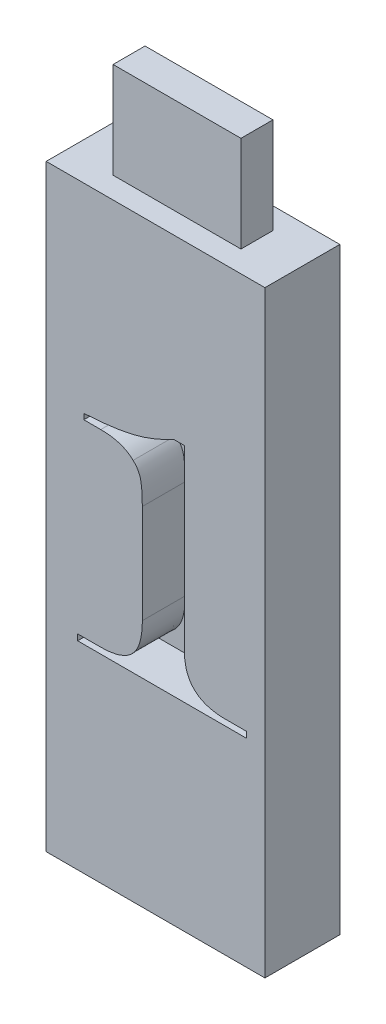
ISO-10303-21;
HEADER;
FILE_DESCRIPTION(('STEP AP214'),'2;1');
FILE_NAME('part.step','',(''),(''),'','','');
FILE_SCHEMA(('AUTOMOTIVE_DESIGN { 1 0 10303 214 1 1 1 1 }'));
ENDSEC;
DATA;
#1=APPLICATION_CONTEXT('core data for automotive mechanical design processes');
#2=APPLICATION_PROTOCOL_DEFINITION('international standard','automotive_design',2000,#1);
#3=PRODUCT_CONTEXT('',#1,'mechanical');
#4=PRODUCT('Part','Part','',(#3));
#5=PRODUCT_RELATED_PRODUCT_CATEGORY('part','',(#4));
#6=PRODUCT_DEFINITION_FORMATION('','',#4);
#7=PRODUCT_DEFINITION_CONTEXT('part definition',#1,'design');
#8=PRODUCT_DEFINITION('design','',#6,#7);
#9=PRODUCT_DEFINITION_SHAPE('','',#8);
#10=(LENGTH_UNIT() NAMED_UNIT(*) SI_UNIT(.MILLI.,.METRE.));
#11=(NAMED_UNIT(*) PLANE_ANGLE_UNIT() SI_UNIT($,.RADIAN.));
#12=(NAMED_UNIT(*) SI_UNIT($,.STERADIAN.) SOLID_ANGLE_UNIT());
#13=UNCERTAINTY_MEASURE_WITH_UNIT(LENGTH_MEASURE(1.E-05),#10,'distance_accuracy_value','');
#14=(GEOMETRIC_REPRESENTATION_CONTEXT(3) GLOBAL_UNCERTAINTY_ASSIGNED_CONTEXT((#13)) GLOBAL_UNIT_ASSIGNED_CONTEXT((#10,
#11,#12)) REPRESENTATION_CONTEXT('',''));
#15=CARTESIAN_POINT('',(0.,0.,0.));
#16=DIRECTION('',(0.,0.,1.));
#17=DIRECTION('',(1.,0.,0.));
#18=AXIS2_PLACEMENT_3D('',#15,#16,#17);
#19=CARTESIAN_POINT('',(-8.69,23.749,5.95));
#20=DIRECTION('',(0.,-1.,0.));
#21=DIRECTION('',(0.,0.,-1.));
#22=AXIS2_PLACEMENT_3D('',#19,#20,#21);
#23=PLANE('',#22);
#24=DIRECTION('',(-1.,0.,0.));
#25=VECTOR('',#24,1.);
#26=CARTESIAN_POINT('',(-8.69,23.749,0.));
#27=LINE('',#26,#25);
#28=CARTESIAN_POINT('',(8.69,23.749,0.));
#29=VERTEX_POINT('',#28);
#30=CARTESIAN_POINT('',(-8.69,23.749,0.));
#31=VERTEX_POINT('',#30);
#32=EDGE_CURVE('E284',#29,#31,#27,.T.);
#33=ORIENTED_EDGE('',*,*,#32,.T.);
#34=DIRECTION('',(0.,0.,-1.));
#35=VECTOR('',#34,1.);
#36=CARTESIAN_POINT('',(-8.69,23.749,5.95));
#37=LINE('',#36,#35);
#38=CARTESIAN_POINT('',(-8.69,23.749,5.95));
#39=VERTEX_POINT('',#38);
#40=EDGE_CURVE('E48',#39,#31,#37,.T.);
#41=ORIENTED_EDGE('',*,*,#40,.F.);
#42=DIRECTION('',(-1.,0.,0.));
#43=VECTOR('',#42,1.);
#44=CARTESIAN_POINT('',(-8.69,23.749,5.95));
#45=LINE('',#44,#43);
#46=CARTESIAN_POINT('',(8.69,23.749,5.95));
#47=VERTEX_POINT('',#46);
#48=EDGE_CURVE('E322',#47,#39,#45,.T.);
#49=ORIENTED_EDGE('',*,*,#48,.F.);
#50=DIRECTION('',(0.,0.,-1.));
#51=VECTOR('',#50,1.);
#52=CARTESIAN_POINT('',(8.69,23.749,5.95));
#53=LINE('',#52,#51);
#54=EDGE_CURVE('E11',#47,#29,#53,.T.);
#55=ORIENTED_EDGE('',*,*,#54,.T.);
#56=EDGE_LOOP('',(#33,#41,#49,#55));
#57=FACE_BOUND('',#56,.T.);
#58=DIRECTION('',(0.,0.,-1.));
#59=VECTOR('',#58,1.);
#60=CARTESIAN_POINT('',(5.08,23.749,4.245));
#61=LINE('',#60,#59);
#62=CARTESIAN_POINT('',(5.08,23.749,4.245));
#63=VERTEX_POINT('',#62);
#64=CARTESIAN_POINT('',(5.08,23.749,1.705));
#65=VERTEX_POINT('',#64);
#66=EDGE_CURVE('E55',#63,#65,#61,.T.);
#67=ORIENTED_EDGE('',*,*,#66,.F.);
#68=DIRECTION('',(1.,0.,0.));
#69=VECTOR('',#68,1.);
#70=CARTESIAN_POINT('',(-5.08,23.749,4.245));
#71=LINE('',#70,#69);
#72=CARTESIAN_POINT('',(-5.08,23.749,4.245));
#73=VERTEX_POINT('',#72);
#74=EDGE_CURVE('E59',#73,#63,#71,.T.);
#75=ORIENTED_EDGE('',*,*,#74,.F.);
#76=DIRECTION('',(0.,0.,1.));
#77=VECTOR('',#76,1.);
#78=CARTESIAN_POINT('',(-5.08,23.749,4.245));
#79=LINE('',#78,#77);
#80=CARTESIAN_POINT('',(-5.08,23.749,1.705));
#81=VERTEX_POINT('',#80);
#82=EDGE_CURVE('E784',#81,#73,#79,.T.);
#83=ORIENTED_EDGE('',*,*,#82,.F.);
#84=DIRECTION('',(-1.,0.,0.));
#85=VECTOR('',#84,1.);
#86=CARTESIAN_POINT('',(-5.08,23.749,1.705));
#87=LINE('',#86,#85);
#88=EDGE_CURVE('E794',#65,#81,#87,.T.);
#89=ORIENTED_EDGE('',*,*,#88,.F.);
#90=EDGE_LOOP('',(#67,#75,#83,#89));
#91=FACE_BOUND('',#90,.T.);
#92=ADVANCED_FACE('F39',(#57,#91),#23,.F.);
#93=CARTESIAN_POINT('',(0.,0.,5.95));
#94=DIRECTION('',(0.,0.,-1.));
#95=DIRECTION('',(-1.,0.,0.));
#96=AXIS2_PLACEMENT_3D('',#93,#94,#95);
#97=PLANE('',#96);
#98=DIRECTION('',(0.,1.,0.));
#99=VECTOR('',#98,1.);
#100=CARTESIAN_POINT('',(8.69,-23.749,5.95));
#101=LINE('',#100,#99);
#102=CARTESIAN_POINT('',(8.69,-23.749,5.95));
#103=VERTEX_POINT('',#102);
#104=EDGE_CURVE('E305',#103,#47,#101,.T.);
#105=ORIENTED_EDGE('',*,*,#104,.T.);
#106=ORIENTED_EDGE('',*,*,#48,.T.);
#107=DIRECTION('',(0.,-1.,0.));
#108=VECTOR('',#107,1.);
#109=CARTESIAN_POINT('',(-8.69,-23.749,5.95));
#110=LINE('',#109,#108);
#111=CARTESIAN_POINT('',(-8.69,-23.749,5.95));
#112=VERTEX_POINT('',#111);
#113=EDGE_CURVE('E297',#39,#112,#110,.T.);
#114=ORIENTED_EDGE('',*,*,#113,.T.);
#115=DIRECTION('',(1.,0.,0.));
#116=VECTOR('',#115,1.);
#117=CARTESIAN_POINT('',(-8.69,-23.749,5.95));
#118=LINE('',#117,#116);
#119=EDGE_CURVE('E313',#112,#103,#118,.T.);
#120=ORIENTED_EDGE('',*,*,#119,.T.);
#121=EDGE_LOOP('',(#105,#106,#114,#120));
#122=FACE_BOUND('',#121,.T.);
#123=DIRECTION('',(0.,1.,0.));
#124=VECTOR('',#123,1.);
#125=CARTESIAN_POINT('',(-6.18915076453345,-7.98771360499018,5.95));
#126=LINE('',#125,#124);
#127=CARTESIAN_POINT('',(-6.18915076453345,-7.98771360499018,5.95));
#128=VERTEX_POINT('',#127);
#129=CARTESIAN_POINT('',(-6.18915076453345,-7.51005577137531,5.95));
#130=VERTEX_POINT('',#129);
#131=EDGE_CURVE('E218',#128,#130,#126,.T.);
#132=ORIENTED_EDGE('',*,*,#131,.T.);
#133=DIRECTION('',(1.,0.,0.));
#134=VECTOR('',#133,1.);
#135=CARTESIAN_POINT('',(-6.18915076453345,-7.51005577137531,5.95));
#136=LINE('',#135,#134);
#137=CARTESIAN_POINT('',(-4.37554367752701,-7.51005577137531,5.95));
#138=VERTEX_POINT('',#137);
#139=EDGE_CURVE('E223',#130,#138,#136,.T.);
#140=ORIENTED_EDGE('',*,*,#139,.T.);
#141=CARTESIAN_POINT('',(-4.37554367752701,-7.51005577137531,5.95));
#142=CARTESIAN_POINT('',(-4.23610003430564,-7.50874102846015,5.95));
#143=CARTESIAN_POINT('',(-3.96525968570146,-7.50618741309811,5.95));
#144=CARTESIAN_POINT('',(-3.57515773941497,-7.46288098301774,5.95));
#145=CARTESIAN_POINT('',(-3.21292964680105,-7.40101134089906,5.95));
#146=CARTESIAN_POINT('',(-2.87995214816045,-7.31261869579678,5.95));
#147=CARTESIAN_POINT('',(-2.576880198355,-7.19594041634851,5.95));
#148=CARTESIAN_POINT('',(-2.29978761363573,-7.05947513325591,5.95));
#149=CARTESIAN_POINT('',(-2.05722729753765,-6.88939866376993,5.95));
#150=CARTESIAN_POINT('',(-1.83988617582516,-6.69689627341764,5.95));
#151=CARTESIAN_POINT('',(-1.65061730047412,-6.47374839688271,5.95));
#152=CARTESIAN_POINT('',(-1.49147228997212,-6.21688447837659,5.95));
#153=CARTESIAN_POINT('',(-1.35158271352618,-5.9313960282205,5.95));
#154=CARTESIAN_POINT('',(-1.24036571081079,-5.61174215076235,5.95));
#155=CARTESIAN_POINT('',(-1.15676772053177,-5.260026908282,5.95));
#156=CARTESIAN_POINT('',(-1.0930190540138,-4.87864815766317,5.95));
#157=CARTESIAN_POINT('',(-1.05562282296083,-4.46573757897142,5.95));
#158=CARTESIAN_POINT('',(-1.05231376730954,-4.18021236020088,5.95));
#159=CARTESIAN_POINT('',(-1.05059735134854,-4.03210967036708,5.95));
#160=B_SPLINE_CURVE_WITH_KNOTS('',3,(#141,#142,#143,#144,#145,#146,#147,#148,#149,#150,#151,
#152,#153,#154,#155,#156,#157,#158,#159),.UNSPECIFIED.,.F.,.F.,(4,1,1,1,1,1,1,1,1,1,1,1,1,1,1,1,
4),(0.,0.0750169889204133,0.145704938289554,0.210982199441047,0.272701169893458,
0.330771263795377,0.385568472334618,0.438501394808148,0.489712458530425,0.541493736534247,
0.595362705983791,0.651958867891753,0.712311685274751,0.777106425736709,0.846343012080092,
0.920297711982541,1.),.UNSPECIFIED.);
#161=CARTESIAN_POINT('',(-1.05059735134854,-4.03210967036708,5.95));
#162=VERTEX_POINT('',#161);
#163=EDGE_CURVE('E591',#138,#162,#160,.T.);
#164=ORIENTED_EDGE('',*,*,#163,.T.);
#165=DIRECTION('',(0.,1.,0.));
#166=VECTOR('',#165,1.);
#167=CARTESIAN_POINT('',(-1.05059735134854,-4.03210967036708,5.95));
#168=LINE('',#167,#166);
#169=CARTESIAN_POINT('',(-1.05059735134854,3.82312267150238,5.95));
#170=VERTEX_POINT('',#169);
#171=EDGE_CURVE('E597',#162,#170,#168,.T.);
#172=ORIENTED_EDGE('',*,*,#171,.T.);
#173=CARTESIAN_POINT('',(-1.05059735134854,3.82312267150238,5.95));
#174=CARTESIAN_POINT('',(-1.05099070588758,4.01847681535995,5.95));
#175=CARTESIAN_POINT('',(-1.05172286109474,4.38209167033187,5.95));
#176=CARTESIAN_POINT('',(-1.08281934121119,4.88372969077205,5.95));
#177=CARTESIAN_POINT('',(-1.12362186760334,5.30054430180468,5.95));
#178=CARTESIAN_POINT('',(-1.18631223309802,5.64251246196481,5.95));
#179=CARTESIAN_POINT('',(-1.27784933856357,5.93419420529454,5.95));
#180=CARTESIAN_POINT('',(-1.40985925874961,6.19089899772735,5.95));
#181=CARTESIAN_POINT('',(-1.57602629633835,6.42838762660998,5.95));
#182=CARTESIAN_POINT('',(-1.71261544534873,6.56412926713396,5.95));
#183=CARTESIAN_POINT('',(-1.7820109090713,6.63309414581483,5.95));
#184=B_SPLINE_CURVE_WITH_KNOTS('',3,(#173,#174,#175,#176,#177,#178,#179,#180,#181,#182,#183),
.UNSPECIFIED.,.F.,.F.,(4,1,1,1,1,1,1,1,4),(0.,0.195476440494539,0.363842487071439,
0.502839566722221,0.614422665441608,0.711274754792311,0.807597286873265,0.902247904788573,1.),.UNSPECIFIED.);
#185=CARTESIAN_POINT('',(-1.7820109090713,6.63309414581483,5.95));
#186=VERTEX_POINT('',#185);
#187=EDGE_CURVE('E604',#170,#186,#184,.T.);
#188=ORIENTED_EDGE('',*,*,#187,.T.);
#189=CARTESIAN_POINT('',(-1.7820109090713,6.63309414581483,5.95));
#190=CARTESIAN_POINT('',(-1.85786908165485,6.69933454417018,5.95));
#191=CARTESIAN_POINT('',(-2.01068954560201,6.83277947256678,5.95));
#192=CARTESIAN_POINT('',(-2.26657065487001,7.00693233106887,5.95));
#193=CARTESIAN_POINT('',(-2.55272251106501,7.14773373539934,5.95));
#194=CARTESIAN_POINT('',(-2.8637657441885,7.26143162650499,5.95));
#195=CARTESIAN_POINT('',(-3.1983525879004,7.35833861437856,5.95));
#196=CARTESIAN_POINT('',(-3.56050980183189,7.41658275676326,5.95));
#197=CARTESIAN_POINT('',(-3.94775190459175,7.46185027267119,5.95));
#198=CARTESIAN_POINT('',(-4.21492627116966,7.46409981427025,5.95));
#199=CARTESIAN_POINT('',(-4.35315346657631,7.46526365281573,5.95));
#200=B_SPLINE_CURVE_WITH_KNOTS('',3,(#189,#190,#191,#192,#193,#194,#195,#196,#197,#198,#199),
.UNSPECIFIED.,.F.,.F.,(4,1,1,1,1,1,1,1,4),(0.,0.109036045176578,0.219659114415069,
0.334153543090579,0.453538768546203,0.578104103389299,0.71079980205562,0.850377366717769,1.),.UNSPECIFIED.);
#201=CARTESIAN_POINT('',(-4.35315346657631,7.46526365281573,5.95));
#202=VERTEX_POINT('',#201);
#203=EDGE_CURVE('E610',#186,#202,#200,.T.);
#204=ORIENTED_EDGE('',*,*,#203,.T.);
#205=DIRECTION('',(-1.,0.,0.));
#206=VECTOR('',#205,1.);
#207=CARTESIAN_POINT('',(-4.35315346657631,7.46526365281573,5.95));
#208=LINE('',#207,#206);
#209=CARTESIAN_POINT('',(-5.70029782544324,7.46526365281573,5.95));
#210=VERTEX_POINT('',#209);
#211=EDGE_CURVE('E619',#202,#210,#208,.T.);
#212=ORIENTED_EDGE('',*,*,#211,.T.);
#213=DIRECTION('',(0.,1.,0.));
#214=VECTOR('',#213,1.);
#215=CARTESIAN_POINT('',(-5.70029782544324,7.46526365281573,5.95));
#216=LINE('',#215,#214);
#217=CARTESIAN_POINT('',(-5.70029782544324,7.90933617000454,5.95));
#218=VERTEX_POINT('',#217);
#219=EDGE_CURVE('E626',#210,#218,#216,.T.);
#220=ORIENTED_EDGE('',*,*,#219,.T.);
#221=CARTESIAN_POINT('',(-5.70029782544324,7.90933617000454,5.95));
#222=CARTESIAN_POINT('',(-5.45143047737275,7.9229585992943,5.95));
#223=CARTESIAN_POINT('',(-4.9669659583837,7.94947707873523,5.95));
#224=CARTESIAN_POINT('',(-4.25899913030741,8.01002373821412,5.95));
#225=CARTESIAN_POINT('',(-3.58940796363513,8.08356334657333,5.95));
#226=CARTESIAN_POINT('',(-2.95443418659469,8.17279995438616,5.95));
#227=CARTESIAN_POINT('',(-2.35298840335099,8.28028574755233,5.95));
#228=CARTESIAN_POINT('',(-1.78214454984667,8.40826926657247,5.95));
#229=CARTESIAN_POINT('',(-1.23801095244961,8.54797874094322,5.95));
#230=CARTESIAN_POINT('',(-0.715430391819257,8.71553333176158,5.95));
#231=CARTESIAN_POINT('',(-0.195727601763085,8.91037522080877,5.95));
#232=CARTESIAN_POINT('',(0.33741676027381,9.13230690572563,5.95));
#233=CARTESIAN_POINT('',(0.886154118734322,9.39705878987949,5.95));
#234=CARTESIAN_POINT('',(1.25603834429261,9.58774249305935,5.95));
#235=CARTESIAN_POINT('',(1.44591116965416,9.68562623875982,5.95));
#236=B_SPLINE_CURVE_WITH_KNOTS('',3,(#221,#222,#223,#224,#225,#226,#227,#228,#229,#230,#231,
#232,#233,#234,#235),.UNSPECIFIED.,.F.,.F.,(4,1,1,1,1,1,1,1,1,1,1,1,4),(0.,0.100545978385056,
0.195730614852711,0.286615425000165,0.372275174389162,0.454369599448173,0.533022142066202,
0.608244380805138,0.680931444364636,0.754290991819458,0.832113082458704,0.913818537877107,1.),.UNSPECIFIED.);
#237=CARTESIAN_POINT('',(1.44591116965416,9.68562623875982,5.95));
#238=VERTEX_POINT('',#237);
#239=EDGE_CURVE('E630',#218,#238,#236,.T.);
#240=ORIENTED_EDGE('',*,*,#239,.T.);
#241=DIRECTION('',(1.,0.,0.));
#242=VECTOR('',#241,1.);
#243=CARTESIAN_POINT('',(1.44591116965416,9.68562623875982,5.95));
#244=LINE('',#243,#242);
#245=CARTESIAN_POINT('',(2.29300748395552,9.68562623875982,5.95));
#246=VERTEX_POINT('',#245);
#247=EDGE_CURVE('E636',#238,#246,#244,.T.);
#248=ORIENTED_EDGE('',*,*,#247,.T.);
#249=DIRECTION('',(0.,-1.,0.));
#250=VECTOR('',#249,1.);
#251=CARTESIAN_POINT('',(2.29300748395552,9.68562623875982,5.95));
#252=LINE('',#251,#250);
#253=CARTESIAN_POINT('',(2.29300748395552,-4.45752367843031,5.95));
#254=VERTEX_POINT('',#253);
#255=EDGE_CURVE('E643',#246,#254,#252,.T.);
#256=ORIENTED_EDGE('',*,*,#255,.T.);
#257=CARTESIAN_POINT('',(2.29300748395552,-4.45752367843031,5.95));
#258=CARTESIAN_POINT('',(2.29431731137845,-4.58081526710359,5.95));
#259=CARTESIAN_POINT('',(2.29686559135136,-4.82068006207079,5.95));
#260=CARTESIAN_POINT('',(2.34058462423329,-5.16726640645375,5.95));
#261=CARTESIAN_POINT('',(2.40232489771927,-5.49108335297564,5.95));
#262=CARTESIAN_POINT('',(2.49085280621763,-5.790612797527,5.95));
#263=CARTESIAN_POINT('',(2.60846598670943,-6.0646716034722,5.95));
#264=CARTESIAN_POINT('',(2.74585186833221,-6.31865292130383,5.95));
#265=CARTESIAN_POINT('',(2.91446779534326,-6.5469008701421,5.95));
#266=CARTESIAN_POINT('',(3.11089720268626,-6.74900946449629,5.95));
#267=CARTESIAN_POINT('',(3.32916805728572,-6.93021895527735,5.95));
#268=CARTESIAN_POINT('',(3.57280886211807,-7.08810541957417,5.95));
#269=CARTESIAN_POINT('',(3.84456582059356,-7.21780194668013,5.95));
#270=CARTESIAN_POINT('',(4.14019436166815,-7.32714773974292,5.95));
#271=CARTESIAN_POINT('',(4.462230563453,-7.407047665968,5.95));
#272=CARTESIAN_POINT('',(4.80887042532651,-7.46684323463618,5.95));
#273=CARTESIAN_POINT('',(5.18049461877157,-7.50499436729588,5.95));
#274=CARTESIAN_POINT('',(5.43749333132193,-7.50833871525566,5.95));
#275=CARTESIAN_POINT('',(5.56944168640748,-7.51005577137531,5.95));
#276=B_SPLINE_CURVE_WITH_KNOTS('',3,(#257,#258,#259,#260,#261,#262,#263,#264,#265,#266,#267,
#268,#269,#270,#271,#272,#273,#274,#275),.UNSPECIFIED.,.F.,.F.,(4,1,1,1,1,1,1,1,1,1,1,1,1,1,1,1,
4),(0.,0.0719768539852749,0.140031558594914,0.203737552029851,0.264433764671674,
0.322068417215544,0.377688680494232,0.432774671570647,0.487253343812736,0.541964170539376,
0.598202901624974,0.656380192321752,0.717535804487765,0.78204497615295,0.849905404874899,
0.922938388533331,1.),.UNSPECIFIED.);
#277=CARTESIAN_POINT('',(5.56944168640748,-7.51005577137531,5.95));
#278=VERTEX_POINT('',#277);
#279=EDGE_CURVE('E647',#254,#278,#276,.T.);
#280=ORIENTED_EDGE('',*,*,#279,.T.);
#281=DIRECTION('',(1.,0.,0.));
#282=VECTOR('',#281,1.);
#283=CARTESIAN_POINT('',(5.56944168640748,-7.51005577137531,5.95));
#284=LINE('',#283,#282);
#285=CARTESIAN_POINT('',(7.24497580588462,-7.51005577137531,5.95));
#286=VERTEX_POINT('',#285);
#287=EDGE_CURVE('E653',#278,#286,#284,.T.);
#288=ORIENTED_EDGE('',*,*,#287,.T.);
#289=DIRECTION('',(0.,-1.,0.));
#290=VECTOR('',#289,1.);
#291=CARTESIAN_POINT('',(7.24497580588462,-7.51005577137531,5.95));
#292=LINE('',#291,#290);
#293=CARTESIAN_POINT('',(7.24497580588462,-7.98771360499018,5.95));
#294=VERTEX_POINT('',#293);
#295=EDGE_CURVE('E660',#286,#294,#292,.T.);
#296=ORIENTED_EDGE('',*,*,#295,.T.);
#297=DIRECTION('',(-1.,0.,0.));
#298=VECTOR('',#297,1.);
#299=CARTESIAN_POINT('',(7.24497580588462,-7.98771360499018,5.95));
#300=LINE('',#299,#298);
#301=EDGE_CURVE('E234',#294,#128,#300,.T.);
#302=ORIENTED_EDGE('',*,*,#301,.T.);
#303=EDGE_LOOP('',(#132,#140,#164,#172,#188,#204,#212,#220,#240,#248,#256,#280,#288,#296,#302));
#304=FACE_BOUND('',#303,.T.);
#305=ADVANCED_FACE('F265',(#122,#304),#97,.F.);
#306=CARTESIAN_POINT('',(8.69,-23.749,5.95));
#307=DIRECTION('',(-1.,0.,0.));
#308=DIRECTION('',(0.,0.,1.));
#309=AXIS2_PLACEMENT_3D('',#306,#307,#308);
#310=PLANE('',#309);
#311=DIRECTION('',(0.,1.,0.));
#312=VECTOR('',#311,1.);
#313=CARTESIAN_POINT('',(8.69,-23.749,0.));
#314=LINE('',#313,#312);
#315=CARTESIAN_POINT('',(8.69,-23.749,0.));
#316=VERTEX_POINT('',#315);
#317=EDGE_CURVE('E293',#316,#29,#314,.T.);
#318=ORIENTED_EDGE('',*,*,#317,.T.);
#319=ORIENTED_EDGE('',*,*,#54,.F.);
#320=ORIENTED_EDGE('',*,*,#104,.F.);
#321=DIRECTION('',(0.,0.,-1.));
#322=VECTOR('',#321,1.);
#323=CARTESIAN_POINT('',(8.69,-23.749,5.95));
#324=LINE('',#323,#322);
#325=EDGE_CURVE('E309',#103,#316,#324,.T.);
#326=ORIENTED_EDGE('',*,*,#325,.T.);
#327=EDGE_LOOP('',(#318,#319,#320,#326));
#328=FACE_BOUND('',#327,.T.);
#329=ADVANCED_FACE('F41',(#328),#310,.F.);
#330=CARTESIAN_POINT('',(-8.69,-23.749,5.95));
#331=DIRECTION('',(1.,0.,0.));
#332=DIRECTION('',(0.,0.,-1.));
#333=AXIS2_PLACEMENT_3D('',#330,#331,#332);
#334=PLANE('',#333);
#335=DIRECTION('',(0.,-1.,0.));
#336=VECTOR('',#335,1.);
#337=CARTESIAN_POINT('',(-8.69,-23.749,0.));
#338=LINE('',#337,#336);
#339=CARTESIAN_POINT('',(-8.69,-23.749,0.));
#340=VERTEX_POINT('',#339);
#341=EDGE_CURVE('E292',#31,#340,#338,.T.);
#342=ORIENTED_EDGE('',*,*,#341,.T.);
#343=DIRECTION('',(0.,0.,-1.));
#344=VECTOR('',#343,1.);
#345=CARTESIAN_POINT('',(-8.69,-23.749,5.95));
#346=LINE('',#345,#344);
#347=EDGE_CURVE('E299',#112,#340,#346,.T.);
#348=ORIENTED_EDGE('',*,*,#347,.F.);
#349=ORIENTED_EDGE('',*,*,#113,.F.);
#350=ORIENTED_EDGE('',*,*,#40,.T.);
#351=EDGE_LOOP('',(#342,#348,#349,#350));
#352=FACE_BOUND('',#351,.T.);
#353=ADVANCED_FACE('F275',(#352),#334,.F.);
#354=CARTESIAN_POINT('',(-8.69,-23.749,5.95));
#355=DIRECTION('',(0.,1.,0.));
#356=DIRECTION('',(0.,0.,1.));
#357=AXIS2_PLACEMENT_3D('',#354,#355,#356);
#358=PLANE('',#357);
#359=DIRECTION('',(1.,0.,0.));
#360=VECTOR('',#359,1.);
#361=CARTESIAN_POINT('',(-8.69,-23.749,0.));
#362=LINE('',#361,#360);
#363=EDGE_CURVE('E301',#340,#316,#362,.T.);
#364=ORIENTED_EDGE('',*,*,#363,.T.);
#365=ORIENTED_EDGE('',*,*,#325,.F.);
#366=ORIENTED_EDGE('',*,*,#119,.F.);
#367=ORIENTED_EDGE('',*,*,#347,.T.);
#368=EDGE_LOOP('',(#364,#365,#366,#367));
#369=FACE_BOUND('',#368,.T.);
#370=ADVANCED_FACE('F271',(#369),#358,.F.);
#371=CARTESIAN_POINT('',(0.,0.,0.));
#372=DIRECTION('',(0.,0.,-1.));
#373=DIRECTION('',(-1.,0.,0.));
#374=AXIS2_PLACEMENT_3D('',#371,#372,#373);
#375=PLANE('',#374);
#376=ORIENTED_EDGE('',*,*,#317,.F.);
#377=ORIENTED_EDGE('',*,*,#363,.F.);
#378=ORIENTED_EDGE('',*,*,#341,.F.);
#379=ORIENTED_EDGE('',*,*,#32,.F.);
#380=EDGE_LOOP('',(#376,#377,#378,#379));
#381=FACE_BOUND('',#380,.T.);
#382=ADVANCED_FACE('F263',(#381),#375,.T.);
#383=CARTESIAN_POINT('',(-6.18915076453345,-7.98771360499018,2.54));
#384=DIRECTION('',(1.,0.,0.));
#385=DIRECTION('',(0.,0.,-1.));
#386=AXIS2_PLACEMENT_3D('',#383,#384,#385);
#387=PLANE('',#386);
#388=ORIENTED_EDGE('',*,*,#131,.F.);
#389=DIRECTION('',(0.,0.,1.));
#390=VECTOR('',#389,1.);
#391=CARTESIAN_POINT('',(-6.18915076453345,-7.98771360499018,2.54));
#392=LINE('',#391,#390);
#393=CARTESIAN_POINT('',(-6.18915076453345,-7.98771360499018,2.54));
#394=VERTEX_POINT('',#393);
#395=EDGE_CURVE('E586',#394,#128,#392,.T.);
#396=ORIENTED_EDGE('',*,*,#395,.F.);
#397=DIRECTION('',(0.,1.,0.));
#398=VECTOR('',#397,1.);
#399=CARTESIAN_POINT('',(-6.18915076453345,-7.98771360499018,2.54));
#400=LINE('',#399,#398);
#401=CARTESIAN_POINT('',(-6.18915076453345,-7.51005577137531,2.54));
#402=VERTEX_POINT('',#401);
#403=EDGE_CURVE('E229',#394,#402,#400,.T.);
#404=ORIENTED_EDGE('',*,*,#403,.T.);
#405=DIRECTION('',(0.,0.,1.));
#406=VECTOR('',#405,1.);
#407=CARTESIAN_POINT('',(-6.18915076453345,-7.51005577137531,2.54));
#408=LINE('',#407,#406);
#409=EDGE_CURVE('E326',#402,#130,#408,.T.);
#410=ORIENTED_EDGE('',*,*,#409,.T.);
#411=EDGE_LOOP('',(#388,#396,#404,#410));
#412=FACE_BOUND('',#411,.T.);
#413=ADVANCED_FACE('F259',(#412),#387,.T.);
#414=CARTESIAN_POINT('',(-6.18915076453345,-7.51005577137531,2.54));
#415=DIRECTION('',(0.,-1.,0.));
#416=DIRECTION('',(0.,0.,-1.));
#417=AXIS2_PLACEMENT_3D('',#414,#415,#416);
#418=PLANE('',#417);
#419=ORIENTED_EDGE('',*,*,#139,.F.);
#420=ORIENTED_EDGE('',*,*,#409,.F.);
#421=DIRECTION('',(1.,0.,0.));
#422=VECTOR('',#421,1.);
#423=CARTESIAN_POINT('',(-6.18915076453345,-7.51005577137531,2.54));
#424=LINE('',#423,#422);
#425=CARTESIAN_POINT('',(-4.37554367752701,-7.51005577137531,2.54));
#426=VERTEX_POINT('',#425);
#427=EDGE_CURVE('E233',#402,#426,#424,.T.);
#428=ORIENTED_EDGE('',*,*,#427,.T.);
#429=DIRECTION('',(0.,0.,1.));
#430=VECTOR('',#429,1.);
#431=CARTESIAN_POINT('',(-4.37554367752701,-7.51005577137531,2.54));
#432=LINE('',#431,#430);
#433=EDGE_CURVE('E330',#426,#138,#432,.T.);
#434=ORIENTED_EDGE('',*,*,#433,.T.);
#435=EDGE_LOOP('',(#419,#420,#428,#434));
#436=FACE_BOUND('',#435,.T.);
#437=ADVANCED_FACE('F254',(#436),#418,.T.);
#438=CARTESIAN_POINT('',(-4.37554367752701,-7.51005577137531,2.54));
#439=CARTESIAN_POINT('',(-4.23610003430564,-7.50874102846015,2.54));
#440=CARTESIAN_POINT('',(-3.96525968570146,-7.50618741309811,2.54));
#441=CARTESIAN_POINT('',(-3.57515773941497,-7.46288098301774,2.54));
#442=CARTESIAN_POINT('',(-3.21292964680105,-7.40101134089906,2.54));
#443=CARTESIAN_POINT('',(-2.87995214816045,-7.31261869579678,2.54));
#444=CARTESIAN_POINT('',(-2.576880198355,-7.19594041634851,2.54));
#445=CARTESIAN_POINT('',(-2.29978761363573,-7.05947513325591,2.54));
#446=CARTESIAN_POINT('',(-2.05722729753765,-6.88939866376993,2.54));
#447=CARTESIAN_POINT('',(-1.83988617582516,-6.69689627341764,2.54));
#448=CARTESIAN_POINT('',(-1.65061730047412,-6.47374839688271,2.54));
#449=CARTESIAN_POINT('',(-1.49147228997212,-6.21688447837659,2.54));
#450=CARTESIAN_POINT('',(-1.35158271352618,-5.9313960282205,2.54));
#451=CARTESIAN_POINT('',(-1.24036571081079,-5.61174215076235,2.54));
#452=CARTESIAN_POINT('',(-1.15676772053177,-5.260026908282,2.54));
#453=CARTESIAN_POINT('',(-1.0930190540138,-4.87864815766317,2.54));
#454=CARTESIAN_POINT('',(-1.05562282296083,-4.46573757897142,2.54));
#455=CARTESIAN_POINT('',(-1.05231376730954,-4.18021236020088,2.54));
#456=CARTESIAN_POINT('',(-1.05059735134854,-4.03210967036708,2.54));
#457=B_SPLINE_CURVE_WITH_KNOTS('',3,(#438,#439,#440,#441,#442,#443,#444,#445,#446,#447,#448,
#449,#450,#451,#452,#453,#454,#455,#456),.UNSPECIFIED.,.F.,.F.,(4,1,1,1,1,1,1,1,1,1,1,1,1,1,1,1,
4),(0.,0.0750169889204133,0.145704938289554,0.210982199441047,0.272701169893458,
0.330771263795377,0.385568472334618,0.438501394808148,0.489712458530425,0.541493736534247,
0.595362705983791,0.651958867891753,0.712311685274751,0.777106425736709,0.846343012080092,
0.920297711982541,1.),.UNSPECIFIED.);
#458=DIRECTION('',(0.,0.,1.));
#459=VECTOR('',#458,1.);
#460=SURFACE_OF_LINEAR_EXTRUSION('',#457,#459);
#461=ORIENTED_EDGE('',*,*,#163,.F.);
#462=ORIENTED_EDGE('',*,*,#433,.F.);
#463=CARTESIAN_POINT('',(-1.05059735134854,-4.03210967036708,2.54));
#464=VERTEX_POINT('',#463);
#465=EDGE_CURVE('E237',#426,#464,#457,.T.);
#466=ORIENTED_EDGE('',*,*,#465,.T.);
#467=DIRECTION('',(0.,0.,1.));
#468=VECTOR('',#467,1.);
#469=CARTESIAN_POINT('',(-1.05059735134854,-4.03210967036708,2.54));
#470=LINE('',#469,#468);
#471=EDGE_CURVE('E334',#464,#162,#470,.T.);
#472=ORIENTED_EDGE('',*,*,#471,.T.);
#473=EDGE_LOOP('',(#461,#462,#466,#472));
#474=FACE_BOUND('',#473,.T.);
#475=ADVANCED_FACE('F249',(#474),#460,.T.);
#476=CARTESIAN_POINT('',(-1.05059735134854,-4.03210967036708,2.54));
#477=DIRECTION('',(1.,0.,0.));
#478=DIRECTION('',(0.,0.,-1.));
#479=AXIS2_PLACEMENT_3D('',#476,#477,#478);
#480=PLANE('',#479);
#481=ORIENTED_EDGE('',*,*,#171,.F.);
#482=ORIENTED_EDGE('',*,*,#471,.F.);
#483=DIRECTION('',(0.,1.,0.));
#484=VECTOR('',#483,1.);
#485=CARTESIAN_POINT('',(-1.05059735134854,-4.03210967036708,2.54));
#486=LINE('',#485,#484);
#487=CARTESIAN_POINT('',(-1.05059735134854,3.82312267150238,2.54));
#488=VERTEX_POINT('',#487);
#489=EDGE_CURVE('E243',#464,#488,#486,.T.);
#490=ORIENTED_EDGE('',*,*,#489,.T.);
#491=DIRECTION('',(0.,0.,1.));
#492=VECTOR('',#491,1.);
#493=CARTESIAN_POINT('',(-1.05059735134854,3.82312267150238,2.54));
#494=LINE('',#493,#492);
#495=EDGE_CURVE('E700',#488,#170,#494,.T.);
#496=ORIENTED_EDGE('',*,*,#495,.T.);
#497=EDGE_LOOP('',(#481,#482,#490,#496));
#498=FACE_BOUND('',#497,.T.);
#499=ADVANCED_FACE('F253',(#498),#480,.T.);
#500=CARTESIAN_POINT('',(-1.05059735134854,3.82312267150238,2.54));
#501=CARTESIAN_POINT('',(-1.05099070588758,4.01847681535995,2.54));
#502=CARTESIAN_POINT('',(-1.05172286109474,4.38209167033187,2.54));
#503=CARTESIAN_POINT('',(-1.08281934121119,4.88372969077205,2.54));
#504=CARTESIAN_POINT('',(-1.12362186760334,5.30054430180468,2.54));
#505=CARTESIAN_POINT('',(-1.18631223309802,5.64251246196481,2.54));
#506=CARTESIAN_POINT('',(-1.27784933856357,5.93419420529454,2.54));
#507=CARTESIAN_POINT('',(-1.40985925874961,6.19089899772735,2.54));
#508=CARTESIAN_POINT('',(-1.57602629633835,6.42838762660998,2.54));
#509=CARTESIAN_POINT('',(-1.71261544534873,6.56412926713396,2.54));
#510=CARTESIAN_POINT('',(-1.7820109090713,6.63309414581483,2.54));
#511=B_SPLINE_CURVE_WITH_KNOTS('',3,(#500,#501,#502,#503,#504,#505,#506,#507,#508,#509,#510),
.UNSPECIFIED.,.F.,.F.,(4,1,1,1,1,1,1,1,4),(0.,0.195476440494539,0.363842487071439,
0.502839566722221,0.614422665441608,0.711274754792311,0.807597286873265,0.902247904788573,1.),.UNSPECIFIED.);
#512=DIRECTION('',(0.,0.,1.));
#513=VECTOR('',#512,1.);
#514=SURFACE_OF_LINEAR_EXTRUSION('',#511,#513);
#515=ORIENTED_EDGE('',*,*,#187,.F.);
#516=ORIENTED_EDGE('',*,*,#495,.F.);
#517=CARTESIAN_POINT('',(-1.7820109090713,6.63309414581483,2.54));
#518=VERTEX_POINT('',#517);
#519=EDGE_CURVE('E714',#488,#518,#511,.T.);
#520=ORIENTED_EDGE('',*,*,#519,.T.);
#521=DIRECTION('',(0.,0.,1.));
#522=VECTOR('',#521,1.);
#523=CARTESIAN_POINT('',(-1.7820109090713,6.63309414581483,2.54));
#524=LINE('',#523,#522);
#525=EDGE_CURVE('E697',#518,#186,#524,.T.);
#526=ORIENTED_EDGE('',*,*,#525,.T.);
#527=EDGE_LOOP('',(#515,#516,#520,#526));
#528=FACE_BOUND('',#527,.T.);
#529=ADVANCED_FACE('F376',(#528),#514,.T.);
#530=CARTESIAN_POINT('',(-1.7820109090713,6.63309414581483,2.54));
#531=CARTESIAN_POINT('',(-1.85786908165485,6.69933454417018,2.54));
#532=CARTESIAN_POINT('',(-2.01068954560201,6.83277947256678,2.54));
#533=CARTESIAN_POINT('',(-2.26657065487001,7.00693233106887,2.54));
#534=CARTESIAN_POINT('',(-2.55272251106501,7.14773373539934,2.54));
#535=CARTESIAN_POINT('',(-2.8637657441885,7.26143162650499,2.54));
#536=CARTESIAN_POINT('',(-3.1983525879004,7.35833861437856,2.54));
#537=CARTESIAN_POINT('',(-3.56050980183189,7.41658275676326,2.54));
#538=CARTESIAN_POINT('',(-3.94775190459175,7.46185027267119,2.54));
#539=CARTESIAN_POINT('',(-4.21492627116966,7.46409981427025,2.54));
#540=CARTESIAN_POINT('',(-4.35315346657631,7.46526365281573,2.54));
#541=B_SPLINE_CURVE_WITH_KNOTS('',3,(#530,#531,#532,#533,#534,#535,#536,#537,#538,#539,#540),
.UNSPECIFIED.,.F.,.F.,(4,1,1,1,1,1,1,1,4),(0.,0.109036045176578,0.219659114415069,
0.334153543090579,0.453538768546203,0.578104103389299,0.71079980205562,0.850377366717769,1.),.UNSPECIFIED.);
#542=DIRECTION('',(0.,0.,1.));
#543=VECTOR('',#542,1.);
#544=SURFACE_OF_LINEAR_EXTRUSION('',#541,#543);
#545=ORIENTED_EDGE('',*,*,#203,.F.);
#546=ORIENTED_EDGE('',*,*,#525,.F.);
#547=CARTESIAN_POINT('',(-4.35315346657631,7.46526365281573,2.54));
#548=VERTEX_POINT('',#547);
#549=EDGE_CURVE('E717',#518,#548,#541,.T.);
#550=ORIENTED_EDGE('',*,*,#549,.T.);
#551=DIRECTION('',(0.,0.,1.));
#552=VECTOR('',#551,1.);
#553=CARTESIAN_POINT('',(-4.35315346657631,7.46526365281573,2.54));
#554=LINE('',#553,#552);
#555=EDGE_CURVE('E694',#548,#202,#554,.T.);
#556=ORIENTED_EDGE('',*,*,#555,.T.);
#557=EDGE_LOOP('',(#545,#546,#550,#556));
#558=FACE_BOUND('',#557,.T.);
#559=ADVANCED_FACE('F383',(#558),#544,.T.);
#560=CARTESIAN_POINT('',(-4.35315346657631,7.46526365281573,2.54));
#561=DIRECTION('',(0.,1.,0.));
#562=DIRECTION('',(0.,0.,1.));
#563=AXIS2_PLACEMENT_3D('',#560,#561,#562);
#564=PLANE('',#563);
#565=ORIENTED_EDGE('',*,*,#211,.F.);
#566=ORIENTED_EDGE('',*,*,#555,.F.);
#567=DIRECTION('',(-1.,0.,0.));
#568=VECTOR('',#567,1.);
#569=CARTESIAN_POINT('',(-4.35315346657631,7.46526365281573,2.54));
#570=LINE('',#569,#568);
#571=CARTESIAN_POINT('',(-5.70029782544324,7.46526365281573,2.54));
#572=VERTEX_POINT('',#571);
#573=EDGE_CURVE('E720',#548,#572,#570,.T.);
#574=ORIENTED_EDGE('',*,*,#573,.T.);
#575=DIRECTION('',(0.,0.,1.));
#576=VECTOR('',#575,1.);
#577=CARTESIAN_POINT('',(-5.70029782544324,7.46526365281573,2.54));
#578=LINE('',#577,#576);
#579=EDGE_CURVE('E691',#572,#210,#578,.T.);
#580=ORIENTED_EDGE('',*,*,#579,.T.);
#581=EDGE_LOOP('',(#565,#566,#574,#580));
#582=FACE_BOUND('',#581,.T.);
#583=ADVANCED_FACE('F390',(#582),#564,.T.);
#584=CARTESIAN_POINT('',(-5.70029782544324,7.46526365281573,2.54));
#585=DIRECTION('',(1.,0.,0.));
#586=DIRECTION('',(0.,0.,-1.));
#587=AXIS2_PLACEMENT_3D('',#584,#585,#586);
#588=PLANE('',#587);
#589=ORIENTED_EDGE('',*,*,#219,.F.);
#590=ORIENTED_EDGE('',*,*,#579,.F.);
#591=DIRECTION('',(0.,1.,0.));
#592=VECTOR('',#591,1.);
#593=CARTESIAN_POINT('',(-5.70029782544324,7.46526365281573,2.54));
#594=LINE('',#593,#592);
#595=CARTESIAN_POINT('',(-5.70029782544324,7.90933617000454,2.54));
#596=VERTEX_POINT('',#595);
#597=EDGE_CURVE('E740',#572,#596,#594,.T.);
#598=ORIENTED_EDGE('',*,*,#597,.T.);
#599=DIRECTION('',(0.,0.,1.));
#600=VECTOR('',#599,1.);
#601=CARTESIAN_POINT('',(-5.70029782544324,7.90933617000454,2.54));
#602=LINE('',#601,#600);
#603=EDGE_CURVE('E688',#596,#218,#602,.T.);
#604=ORIENTED_EDGE('',*,*,#603,.T.);
#605=EDGE_LOOP('',(#589,#590,#598,#604));
#606=FACE_BOUND('',#605,.T.);
#607=ADVANCED_FACE('F398',(#606),#588,.T.);
#608=CARTESIAN_POINT('',(-5.70029782544324,7.90933617000454,2.54));
#609=CARTESIAN_POINT('',(-5.45143047737275,7.9229585992943,2.54));
#610=CARTESIAN_POINT('',(-4.9669659583837,7.94947707873523,2.54));
#611=CARTESIAN_POINT('',(-4.25899913030741,8.01002373821412,2.54));
#612=CARTESIAN_POINT('',(-3.58940796363513,8.08356334657333,2.54));
#613=CARTESIAN_POINT('',(-2.95443418659469,8.17279995438616,2.54));
#614=CARTESIAN_POINT('',(-2.35298840335099,8.28028574755233,2.54));
#615=CARTESIAN_POINT('',(-1.78214454984667,8.40826926657247,2.54));
#616=CARTESIAN_POINT('',(-1.23801095244961,8.54797874094322,2.54));
#617=CARTESIAN_POINT('',(-0.715430391819257,8.71553333176158,2.54));
#618=CARTESIAN_POINT('',(-0.195727601763085,8.91037522080877,2.54));
#619=CARTESIAN_POINT('',(0.33741676027381,9.13230690572563,2.54));
#620=CARTESIAN_POINT('',(0.886154118734322,9.39705878987949,2.54));
#621=CARTESIAN_POINT('',(1.25603834429261,9.58774249305935,2.54));
#622=CARTESIAN_POINT('',(1.44591116965416,9.68562623875982,2.54));
#623=B_SPLINE_CURVE_WITH_KNOTS('',3,(#608,#609,#610,#611,#612,#613,#614,#615,#616,#617,#618,
#619,#620,#621,#622),.UNSPECIFIED.,.F.,.F.,(4,1,1,1,1,1,1,1,1,1,1,1,4),(0.,0.100545978385056,
0.195730614852711,0.286615425000165,0.372275174389162,0.454369599448173,0.533022142066202,
0.608244380805138,0.680931444364636,0.754290991819458,0.832113082458704,0.913818537877107,1.),.UNSPECIFIED.);
#624=DIRECTION('',(0.,0.,1.));
#625=VECTOR('',#624,1.);
#626=SURFACE_OF_LINEAR_EXTRUSION('',#623,#625);
#627=ORIENTED_EDGE('',*,*,#239,.F.);
#628=ORIENTED_EDGE('',*,*,#603,.F.);
#629=CARTESIAN_POINT('',(1.44591116965416,9.68562623875982,2.54));
#630=VERTEX_POINT('',#629);
#631=EDGE_CURVE('E733',#596,#630,#623,.T.);
#632=ORIENTED_EDGE('',*,*,#631,.T.);
#633=DIRECTION('',(0.,0.,1.));
#634=VECTOR('',#633,1.);
#635=CARTESIAN_POINT('',(1.44591116965416,9.68562623875982,2.54));
#636=LINE('',#635,#634);
#637=EDGE_CURVE('E685',#630,#238,#636,.T.);
#638=ORIENTED_EDGE('',*,*,#637,.T.);
#639=EDGE_LOOP('',(#627,#628,#632,#638));
#640=FACE_BOUND('',#639,.T.);
#641=ADVANCED_FACE('F406',(#640),#626,.T.);
#642=CARTESIAN_POINT('',(1.44591116965416,9.68562623875982,2.54));
#643=DIRECTION('',(0.,-1.,0.));
#644=DIRECTION('',(0.,0.,-1.));
#645=AXIS2_PLACEMENT_3D('',#642,#643,#644);
#646=PLANE('',#645);
#647=ORIENTED_EDGE('',*,*,#247,.F.);
#648=ORIENTED_EDGE('',*,*,#637,.F.);
#649=DIRECTION('',(1.,0.,0.));
#650=VECTOR('',#649,1.);
#651=CARTESIAN_POINT('',(1.44591116965416,9.68562623875982,2.54));
#652=LINE('',#651,#650);
#653=CARTESIAN_POINT('',(2.29300748395552,9.68562623875982,2.54));
#654=VERTEX_POINT('',#653);
#655=EDGE_CURVE('E739',#630,#654,#652,.T.);
#656=ORIENTED_EDGE('',*,*,#655,.T.);
#657=DIRECTION('',(0.,0.,1.));
#658=VECTOR('',#657,1.);
#659=CARTESIAN_POINT('',(2.29300748395552,9.68562623875982,2.54));
#660=LINE('',#659,#658);
#661=EDGE_CURVE('E682',#654,#246,#660,.T.);
#662=ORIENTED_EDGE('',*,*,#661,.T.);
#663=EDGE_LOOP('',(#647,#648,#656,#662));
#664=FACE_BOUND('',#663,.T.);
#665=ADVANCED_FACE('F414',(#664),#646,.T.);
#666=CARTESIAN_POINT('',(2.29300748395552,9.68562623875982,2.54));
#667=DIRECTION('',(-1.,0.,0.));
#668=DIRECTION('',(0.,0.,1.));
#669=AXIS2_PLACEMENT_3D('',#666,#667,#668);
#670=PLANE('',#669);
#671=ORIENTED_EDGE('',*,*,#255,.F.);
#672=ORIENTED_EDGE('',*,*,#661,.F.);
#673=DIRECTION('',(0.,-1.,0.));
#674=VECTOR('',#673,1.);
#675=CARTESIAN_POINT('',(2.29300748395552,9.68562623875982,2.54));
#676=LINE('',#675,#674);
#677=CARTESIAN_POINT('',(2.29300748395552,-4.45752367843031,2.54));
#678=VERTEX_POINT('',#677);
#679=EDGE_CURVE('E574',#654,#678,#676,.T.);
#680=ORIENTED_EDGE('',*,*,#679,.T.);
#681=DIRECTION('',(0.,0.,1.));
#682=VECTOR('',#681,1.);
#683=CARTESIAN_POINT('',(2.29300748395552,-4.45752367843031,2.54));
#684=LINE('',#683,#682);
#685=EDGE_CURVE('E679',#678,#254,#684,.T.);
#686=ORIENTED_EDGE('',*,*,#685,.T.);
#687=EDGE_LOOP('',(#671,#672,#680,#686));
#688=FACE_BOUND('',#687,.T.);
#689=ADVANCED_FACE('F422',(#688),#670,.T.);
#690=CARTESIAN_POINT('',(2.29300748395552,-4.45752367843031,2.54));
#691=CARTESIAN_POINT('',(2.29431731137845,-4.58081526710359,2.54));
#692=CARTESIAN_POINT('',(2.29686559135136,-4.82068006207079,2.54));
#693=CARTESIAN_POINT('',(2.34058462423329,-5.16726640645375,2.54));
#694=CARTESIAN_POINT('',(2.40232489771927,-5.49108335297564,2.54));
#695=CARTESIAN_POINT('',(2.49085280621763,-5.790612797527,2.54));
#696=CARTESIAN_POINT('',(2.60846598670943,-6.0646716034722,2.54));
#697=CARTESIAN_POINT('',(2.74585186833221,-6.31865292130383,2.54));
#698=CARTESIAN_POINT('',(2.91446779534326,-6.5469008701421,2.54));
#699=CARTESIAN_POINT('',(3.11089720268626,-6.74900946449629,2.54));
#700=CARTESIAN_POINT('',(3.32916805728572,-6.93021895527735,2.54));
#701=CARTESIAN_POINT('',(3.57280886211807,-7.08810541957417,2.54));
#702=CARTESIAN_POINT('',(3.84456582059356,-7.21780194668013,2.54));
#703=CARTESIAN_POINT('',(4.14019436166815,-7.32714773974292,2.54));
#704=CARTESIAN_POINT('',(4.462230563453,-7.407047665968,2.54));
#705=CARTESIAN_POINT('',(4.80887042532651,-7.46684323463618,2.54));
#706=CARTESIAN_POINT('',(5.18049461877157,-7.50499436729588,2.54));
#707=CARTESIAN_POINT('',(5.43749333132193,-7.50833871525566,2.54));
#708=CARTESIAN_POINT('',(5.56944168640748,-7.51005577137531,2.54));
#709=B_SPLINE_CURVE_WITH_KNOTS('',3,(#690,#691,#692,#693,#694,#695,#696,#697,#698,#699,#700,
#701,#702,#703,#704,#705,#706,#707,#708),.UNSPECIFIED.,.F.,.F.,(4,1,1,1,1,1,1,1,1,1,1,1,1,1,1,1,
4),(0.,0.0719768539852749,0.140031558594914,0.203737552029851,0.264433764671674,
0.322068417215544,0.377688680494232,0.432774671570647,0.487253343812736,0.541964170539376,
0.598202901624974,0.656380192321752,0.717535804487765,0.78204497615295,0.849905404874899,
0.922938388533331,1.),.UNSPECIFIED.);
#710=DIRECTION('',(0.,0.,1.));
#711=VECTOR('',#710,1.);
#712=SURFACE_OF_LINEAR_EXTRUSION('',#709,#711);
#713=ORIENTED_EDGE('',*,*,#279,.F.);
#714=ORIENTED_EDGE('',*,*,#685,.F.);
#715=CARTESIAN_POINT('',(5.56944168640748,-7.51005577137531,2.54));
#716=VERTEX_POINT('',#715);
#717=EDGE_CURVE('E566',#678,#716,#709,.T.);
#718=ORIENTED_EDGE('',*,*,#717,.T.);
#719=DIRECTION('',(0.,0.,1.));
#720=VECTOR('',#719,1.);
#721=CARTESIAN_POINT('',(5.56944168640748,-7.51005577137531,2.54));
#722=LINE('',#721,#720);
#723=EDGE_CURVE('E676',#716,#278,#722,.T.);
#724=ORIENTED_EDGE('',*,*,#723,.T.);
#725=EDGE_LOOP('',(#713,#714,#718,#724));
#726=FACE_BOUND('',#725,.T.);
#727=ADVANCED_FACE('F430',(#726),#712,.T.);
#728=CARTESIAN_POINT('',(5.56944168640748,-7.51005577137531,2.54));
#729=DIRECTION('',(0.,-1.,0.));
#730=DIRECTION('',(0.,0.,-1.));
#731=AXIS2_PLACEMENT_3D('',#728,#729,#730);
#732=PLANE('',#731);
#733=ORIENTED_EDGE('',*,*,#287,.F.);
#734=ORIENTED_EDGE('',*,*,#723,.F.);
#735=DIRECTION('',(1.,0.,0.));
#736=VECTOR('',#735,1.);
#737=CARTESIAN_POINT('',(5.56944168640748,-7.51005577137531,2.54));
#738=LINE('',#737,#736);
#739=CARTESIAN_POINT('',(7.24497580588462,-7.51005577137531,2.54));
#740=VERTEX_POINT('',#739);
#741=EDGE_CURVE('E573',#716,#740,#738,.T.);
#742=ORIENTED_EDGE('',*,*,#741,.T.);
#743=DIRECTION('',(0.,0.,1.));
#744=VECTOR('',#743,1.);
#745=CARTESIAN_POINT('',(7.24497580588462,-7.51005577137531,2.54));
#746=LINE('',#745,#744);
#747=EDGE_CURVE('E673',#740,#286,#746,.T.);
#748=ORIENTED_EDGE('',*,*,#747,.T.);
#749=EDGE_LOOP('',(#733,#734,#742,#748));
#750=FACE_BOUND('',#749,.T.);
#751=ADVANCED_FACE('F438',(#750),#732,.T.);
#752=CARTESIAN_POINT('',(7.24497580588462,-7.51005577137531,2.54));
#753=DIRECTION('',(-1.,0.,0.));
#754=DIRECTION('',(0.,0.,1.));
#755=AXIS2_PLACEMENT_3D('',#752,#753,#754);
#756=PLANE('',#755);
#757=ORIENTED_EDGE('',*,*,#295,.F.);
#758=ORIENTED_EDGE('',*,*,#747,.F.);
#759=DIRECTION('',(0.,-1.,0.));
#760=VECTOR('',#759,1.);
#761=CARTESIAN_POINT('',(7.24497580588462,-7.51005577137531,2.54));
#762=LINE('',#761,#760);
#763=CARTESIAN_POINT('',(7.24497580588462,-7.98771360499018,2.54));
#764=VERTEX_POINT('',#763);
#765=EDGE_CURVE('E581',#740,#764,#762,.T.);
#766=ORIENTED_EDGE('',*,*,#765,.T.);
#767=DIRECTION('',(0.,0.,1.));
#768=VECTOR('',#767,1.);
#769=CARTESIAN_POINT('',(7.24497580588462,-7.98771360499018,2.54));
#770=LINE('',#769,#768);
#771=EDGE_CURVE('E670',#764,#294,#770,.T.);
#772=ORIENTED_EDGE('',*,*,#771,.T.);
#773=EDGE_LOOP('',(#757,#758,#766,#772));
#774=FACE_BOUND('',#773,.T.);
#775=ADVANCED_FACE('F446',(#774),#756,.T.);
#776=CARTESIAN_POINT('',(7.24497580588462,-7.98771360499018,2.54));
#777=DIRECTION('',(0.,1.,0.));
#778=DIRECTION('',(0.,0.,1.));
#779=AXIS2_PLACEMENT_3D('',#776,#777,#778);
#780=PLANE('',#779);
#781=ORIENTED_EDGE('',*,*,#301,.F.);
#782=ORIENTED_EDGE('',*,*,#771,.F.);
#783=DIRECTION('',(-1.,0.,0.));
#784=VECTOR('',#783,1.);
#785=CARTESIAN_POINT('',(7.24497580588462,-7.98771360499018,2.54));
#786=LINE('',#785,#784);
#787=EDGE_CURVE('E584',#764,#394,#786,.T.);
#788=ORIENTED_EDGE('',*,*,#787,.T.);
#789=ORIENTED_EDGE('',*,*,#395,.T.);
#790=EDGE_LOOP('',(#781,#782,#788,#789));
#791=FACE_BOUND('',#790,.T.);
#792=ADVANCED_FACE('F454',(#791),#780,.T.);
#793=CARTESIAN_POINT('',(-1.80588904437989,-6.65125250229036,2.54));
#794=DIRECTION('',(0.,1.69405249583322E-13,-1.));
#795=DIRECTION('',(0.,1.,1.69405249583322E-13));
#796=AXIS2_PLACEMENT_3D('',#793,#794,#795);
#797=PLANE('',#796);
#798=ORIENTED_EDGE('',*,*,#403,.F.);
#799=ORIENTED_EDGE('',*,*,#787,.F.);
#800=ORIENTED_EDGE('',*,*,#765,.F.);
#801=ORIENTED_EDGE('',*,*,#741,.F.);
#802=ORIENTED_EDGE('',*,*,#717,.F.);
#803=ORIENTED_EDGE('',*,*,#679,.F.);
#804=ORIENTED_EDGE('',*,*,#655,.F.);
#805=ORIENTED_EDGE('',*,*,#631,.F.);
#806=ORIENTED_EDGE('',*,*,#597,.F.);
#807=ORIENTED_EDGE('',*,*,#573,.F.);
#808=ORIENTED_EDGE('',*,*,#549,.F.);
#809=ORIENTED_EDGE('',*,*,#519,.F.);
#810=ORIENTED_EDGE('',*,*,#489,.F.);
#811=ORIENTED_EDGE('',*,*,#465,.F.);
#812=ORIENTED_EDGE('',*,*,#427,.F.);
#813=EDGE_LOOP('',(#798,#799,#800,#801,#802,#803,#804,#805,#806,#807,#808,#809,#810,#811,#812));
#814=FACE_BOUND('',#813,.T.);
#815=ADVANCED_FACE('F462',(#814),#797,.F.);
#816=CARTESIAN_POINT('',(5.08,31.369,4.245));
#817=DIRECTION('',(-1.,0.,0.));
#818=DIRECTION('',(0.,0.,1.));
#819=AXIS2_PLACEMENT_3D('',#816,#817,#818);
#820=PLANE('',#819);
#821=ORIENTED_EDGE('',*,*,#66,.T.);
#822=DIRECTION('',(0.,-1.,0.));
#823=VECTOR('',#822,1.);
#824=CARTESIAN_POINT('',(5.08,31.369,1.705));
#825=LINE('',#824,#823);
#826=CARTESIAN_POINT('',(5.08,31.369,1.705));
#827=VERTEX_POINT('',#826);
#828=EDGE_CURVE('E198',#827,#65,#825,.T.);
#829=ORIENTED_EDGE('',*,*,#828,.F.);
#830=DIRECTION('',(0.,0.,-1.));
#831=VECTOR('',#830,1.);
#832=CARTESIAN_POINT('',(5.08,31.369,4.245));
#833=LINE('',#832,#831);
#834=CARTESIAN_POINT('',(5.08,31.369,4.245));
#835=VERTEX_POINT('',#834);
#836=EDGE_CURVE('E205',#835,#827,#833,.T.);
#837=ORIENTED_EDGE('',*,*,#836,.F.);
#838=DIRECTION('',(0.,-1.,0.));
#839=VECTOR('',#838,1.);
#840=CARTESIAN_POINT('',(5.08,31.369,4.245));
#841=LINE('',#840,#839);
#842=EDGE_CURVE('E781',#835,#63,#841,.T.);
#843=ORIENTED_EDGE('',*,*,#842,.T.);
#844=EDGE_LOOP('',(#821,#829,#837,#843));
#845=FACE_BOUND('',#844,.T.);
#846=ADVANCED_FACE('F216',(#845),#820,.F.);
#847=CARTESIAN_POINT('',(-5.08,31.369,1.705));
#848=DIRECTION('',(0.,0.,1.));
#849=DIRECTION('',(1.,0.,0.));
#850=AXIS2_PLACEMENT_3D('',#847,#848,#849);
#851=PLANE('',#850);
#852=ORIENTED_EDGE('',*,*,#88,.T.);
#853=DIRECTION('',(0.,-1.,0.));
#854=VECTOR('',#853,1.);
#855=CARTESIAN_POINT('',(-5.08,31.369,1.705));
#856=LINE('',#855,#854);
#857=CARTESIAN_POINT('',(-5.08,31.369,1.705));
#858=VERTEX_POINT('',#857);
#859=EDGE_CURVE('E200',#858,#81,#856,.T.);
#860=ORIENTED_EDGE('',*,*,#859,.F.);
#861=DIRECTION('',(-1.,0.,0.));
#862=VECTOR('',#861,1.);
#863=CARTESIAN_POINT('',(-5.08,31.369,1.705));
#864=LINE('',#863,#862);
#865=EDGE_CURVE('E193',#827,#858,#864,.T.);
#866=ORIENTED_EDGE('',*,*,#865,.F.);
#867=ORIENTED_EDGE('',*,*,#828,.T.);
#868=EDGE_LOOP('',(#852,#860,#866,#867));
#869=FACE_BOUND('',#868,.T.);
#870=ADVANCED_FACE('F196',(#869),#851,.F.);
#871=CARTESIAN_POINT('',(-5.08,31.369,4.245));
#872=DIRECTION('',(1.,0.,0.));
#873=DIRECTION('',(0.,0.,-1.));
#874=AXIS2_PLACEMENT_3D('',#871,#872,#873);
#875=PLANE('',#874);
#876=ORIENTED_EDGE('',*,*,#82,.T.);
#877=DIRECTION('',(0.,-1.,0.));
#878=VECTOR('',#877,1.);
#879=CARTESIAN_POINT('',(-5.08,31.369,4.245));
#880=LINE('',#879,#878);
#881=CARTESIAN_POINT('',(-5.08,31.369,4.245));
#882=VERTEX_POINT('',#881);
#883=EDGE_CURVE('E225',#882,#73,#880,.T.);
#884=ORIENTED_EDGE('',*,*,#883,.F.);
#885=DIRECTION('',(0.,0.,1.));
#886=VECTOR('',#885,1.);
#887=CARTESIAN_POINT('',(-5.08,31.369,4.245));
#888=LINE('',#887,#886);
#889=EDGE_CURVE('E204',#858,#882,#888,.T.);
#890=ORIENTED_EDGE('',*,*,#889,.F.);
#891=ORIENTED_EDGE('',*,*,#859,.T.);
#892=EDGE_LOOP('',(#876,#884,#890,#891));
#893=FACE_BOUND('',#892,.T.);
#894=ADVANCED_FACE('F483',(#893),#875,.F.);
#895=CARTESIAN_POINT('',(-5.08,31.369,4.245));
#896=DIRECTION('',(0.,0.,-1.));
#897=DIRECTION('',(-1.,0.,0.));
#898=AXIS2_PLACEMENT_3D('',#895,#896,#897);
#899=PLANE('',#898);
#900=ORIENTED_EDGE('',*,*,#74,.T.);
#901=ORIENTED_EDGE('',*,*,#842,.F.);
#902=DIRECTION('',(1.,0.,0.));
#903=VECTOR('',#902,1.);
#904=CARTESIAN_POINT('',(-5.08,31.369,4.245));
#905=LINE('',#904,#903);
#906=EDGE_CURVE('E210',#882,#835,#905,.T.);
#907=ORIENTED_EDGE('',*,*,#906,.F.);
#908=ORIENTED_EDGE('',*,*,#883,.T.);
#909=EDGE_LOOP('',(#900,#901,#907,#908));
#910=FACE_BOUND('',#909,.T.);
#911=ADVANCED_FACE('F490',(#910),#899,.F.);
#912=CARTESIAN_POINT('',(0.,31.369,0.));
#913=DIRECTION('',(0.,-1.,0.));
#914=DIRECTION('',(0.,0.,-1.));
#915=AXIS2_PLACEMENT_3D('',#912,#913,#914);
#916=PLANE('',#915);
#917=ORIENTED_EDGE('',*,*,#836,.T.);
#918=ORIENTED_EDGE('',*,*,#865,.T.);
#919=ORIENTED_EDGE('',*,*,#889,.T.);
#920=ORIENTED_EDGE('',*,*,#906,.T.);
#921=EDGE_LOOP('',(#917,#918,#919,#920));
#922=FACE_BOUND('',#921,.T.);
#923=ADVANCED_FACE('F208',(#922),#916,.F.);
#924=CLOSED_SHELL('',(#92,#305,#329,#353,#370,#382,#413,#437,#475,#499,#529,#559,#583,#607,#641,
#665,#689,#727,#751,#775,#792,#815,#846,#870,#894,#911,#923));
#925=MANIFOLD_SOLID_BREP('B2',#924);
#926=ADVANCED_BREP_SHAPE_REPRESENTATION('',(#18,#925),#14);
#927=SHAPE_DEFINITION_REPRESENTATION(#9,#926);
ENDSEC;
END-ISO-10303-21;
